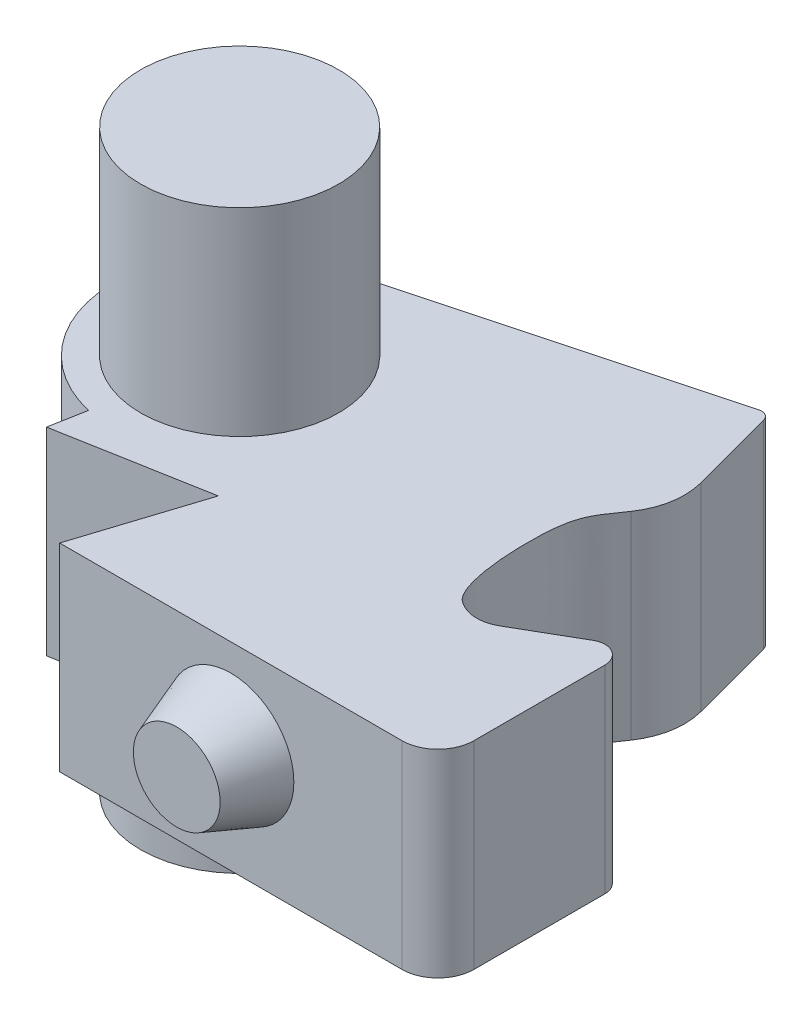
ISO-10303-21;
HEADER;
FILE_DESCRIPTION(('STEP AP214'),'2;1');
FILE_NAME('part.step','',(''),(''),'','','');
FILE_SCHEMA(('AUTOMOTIVE_DESIGN { 1 0 10303 214 1 1 1 1 }'));
ENDSEC;
DATA;
#1=APPLICATION_CONTEXT('core data for automotive mechanical design processes');
#2=APPLICATION_PROTOCOL_DEFINITION('international standard','automotive_design',2000,#1);
#3=PRODUCT_CONTEXT('',#1,'mechanical');
#4=PRODUCT('Part','Part','',(#3));
#5=PRODUCT_RELATED_PRODUCT_CATEGORY('part','',(#4));
#6=PRODUCT_DEFINITION_FORMATION('','',#4);
#7=PRODUCT_DEFINITION_CONTEXT('part definition',#1,'design');
#8=PRODUCT_DEFINITION('design','',#6,#7);
#9=PRODUCT_DEFINITION_SHAPE('','',#8);
#10=(LENGTH_UNIT() NAMED_UNIT(*) SI_UNIT(.MILLI.,.METRE.));
#11=(NAMED_UNIT(*) PLANE_ANGLE_UNIT() SI_UNIT($,.RADIAN.));
#12=(NAMED_UNIT(*) SI_UNIT($,.STERADIAN.) SOLID_ANGLE_UNIT());
#13=UNCERTAINTY_MEASURE_WITH_UNIT(LENGTH_MEASURE(1.E-05),#10,'distance_accuracy_value','');
#14=(GEOMETRIC_REPRESENTATION_CONTEXT(3) GLOBAL_UNCERTAINTY_ASSIGNED_CONTEXT((#13)) GLOBAL_UNIT_ASSIGNED_CONTEXT((#10,
#11,#12)) REPRESENTATION_CONTEXT('',''));
#15=CARTESIAN_POINT('',(0.,0.,0.));
#16=DIRECTION('',(0.,0.,1.));
#17=DIRECTION('',(1.,0.,0.));
#18=AXIS2_PLACEMENT_3D('',#15,#16,#17);
#19=CARTESIAN_POINT('',(3.01010442416642,2.2,-1.12998792942315));
#20=DIRECTION('',(0.,-1.,0.));
#21=DIRECTION('',(0.,0.,-1.));
#22=AXIS2_PLACEMENT_3D('',#19,#20,#21);
#23=CYLINDRICAL_SURFACE('',#22,0.8);
#24=CARTESIAN_POINT('',(3.01010442416642,0.,-1.12998792942315));
#25=DIRECTION('',(0.,1.,0.));
#26=DIRECTION('',(0.,0.,1.));
#27=AXIS2_PLACEMENT_3D('',#24,#25,#26);
#28=CIRCLE('',#27,0.8);
#29=CARTESIAN_POINT('',(3.78284508519767,0.,-1.33704316550517));
#30=VERTEX_POINT('',#29);
#31=CARTESIAN_POINT('',(3.66810176337064,0.,-0.674971993877858));
#32=VERTEX_POINT('',#31);
#33=EDGE_CURVE('E231',#30,#32,#28,.F.);
#34=ORIENTED_EDGE('',*,*,#33,.F.);
#35=DIRECTION('',(0.,-1.,0.));
#36=VECTOR('',#35,1.);
#37=CARTESIAN_POINT('',(3.78284508519767,2.2,-1.33704316550517));
#38=LINE('',#37,#36);
#39=CARTESIAN_POINT('',(3.78284508519767,2.2,-1.33704316550517));
#40=VERTEX_POINT('',#39);
#41=EDGE_CURVE('E295',#40,#30,#38,.T.);
#42=ORIENTED_EDGE('',*,*,#41,.F.);
#43=CARTESIAN_POINT('',(3.01010442416642,2.2,-1.12998792942315));
#44=DIRECTION('',(0.,1.,0.));
#45=DIRECTION('',(0.,0.,1.));
#46=AXIS2_PLACEMENT_3D('',#43,#44,#45);
#47=CIRCLE('',#46,0.8);
#48=CARTESIAN_POINT('',(3.66810176337064,2.2,-0.674971993877858));
#49=VERTEX_POINT('',#48);
#50=EDGE_CURVE('E375',#40,#49,#47,.F.);
#51=ORIENTED_EDGE('',*,*,#50,.T.);
#52=DIRECTION('',(0.,-1.,0.));
#53=VECTOR('',#52,1.);
#54=CARTESIAN_POINT('',(3.66810176337064,2.2,-0.674971993877858));
#55=LINE('',#54,#53);
#56=EDGE_CURVE('E163',#49,#32,#55,.T.);
#57=ORIENTED_EDGE('',*,*,#56,.T.);
#58=EDGE_LOOP('',(#34,#42,#51,#57));
#59=FACE_BOUND('',#58,.T.);
#60=ADVANCED_FACE('F88',(#59),#23,.T.);
#61=CARTESIAN_POINT('',(3.86370330515627,2.2,-1.0352761804101));
#62=DIRECTION('',(0.965925826289067,0.,-0.258819045102525));
#63=DIRECTION('',(-0.258819045102525,0.,-0.965925826289067));
#64=AXIS2_PLACEMENT_3D('',#61,#62,#63);
#65=PLANE('',#64);
#66=DIRECTION('',(0.258819045102525,0.,0.965925826289067));
#67=VECTOR('',#66,1.);
#68=CARTESIAN_POINT('',(3.86370330515627,0.,-1.0352761804101));
#69=LINE('',#68,#67);
#70=CARTESIAN_POINT('',(3.52723854652299,0.,-2.29097975458589));
#71=VERTEX_POINT('',#70);
#72=EDGE_CURVE('E238',#71,#30,#69,.T.);
#73=ORIENTED_EDGE('',*,*,#72,.F.);
#74=DIRECTION('',(0.,-1.,0.));
#75=VECTOR('',#74,1.);
#76=CARTESIAN_POINT('',(3.52723854652299,2.2,-2.29097975458589));
#77=LINE('',#76,#75);
#78=CARTESIAN_POINT('',(3.52723854652299,2.2,-2.29097975458589));
#79=VERTEX_POINT('',#78);
#80=EDGE_CURVE('E293',#79,#71,#77,.T.);
#81=ORIENTED_EDGE('',*,*,#80,.F.);
#82=DIRECTION('',(0.258819045102525,0.,0.965925826289067));
#83=VECTOR('',#82,1.);
#84=CARTESIAN_POINT('',(3.86370330515627,2.2,-1.0352761804101));
#85=LINE('',#84,#83);
#86=EDGE_CURVE('E378',#79,#40,#85,.T.);
#87=ORIENTED_EDGE('',*,*,#86,.T.);
#88=ORIENTED_EDGE('',*,*,#41,.T.);
#89=EDGE_LOOP('',(#73,#81,#87,#88));
#90=FACE_BOUND('',#89,.T.);
#91=ADVANCED_FACE('F317',(#90),#65,.T.);
#92=CARTESIAN_POINT('',(3.43064596389408,2.2,-2.26509785007563));
#93=DIRECTION('',(0.,-1.,0.));
#94=DIRECTION('',(0.,0.,-1.));
#95=AXIS2_PLACEMENT_3D('',#92,#93,#94);
#96=CYLINDRICAL_SURFACE('',#95,0.1);
#97=CARTESIAN_POINT('',(3.43064596389408,0.,-2.26509785007563));
#98=DIRECTION('',(0.,1.,0.));
#99=DIRECTION('',(0.,0.,1.));
#100=AXIS2_PLACEMENT_3D('',#97,#98,#99);
#101=CIRCLE('',#100,0.1);
#102=CARTESIAN_POINT('',(3.40476405938383,0.,-2.36169043270454));
#103=VERTEX_POINT('',#102);
#104=EDGE_CURVE('E241',#103,#71,#101,.F.);
#105=ORIENTED_EDGE('',*,*,#104,.F.);
#106=DIRECTION('',(0.,-1.,0.));
#107=VECTOR('',#106,1.);
#108=CARTESIAN_POINT('',(3.40476405938383,2.2,-2.36169043270454));
#109=LINE('',#108,#107);
#110=CARTESIAN_POINT('',(3.40476405938383,2.2,-2.36169043270454));
#111=VERTEX_POINT('',#110);
#112=EDGE_CURVE('E291',#111,#103,#109,.T.);
#113=ORIENTED_EDGE('',*,*,#112,.F.);
#114=CARTESIAN_POINT('',(3.43064596389408,2.2,-2.26509785007563));
#115=DIRECTION('',(0.,1.,0.));
#116=DIRECTION('',(0.,0.,1.));
#117=AXIS2_PLACEMENT_3D('',#114,#115,#116);
#118=CIRCLE('',#117,0.1);
#119=EDGE_CURVE('E380',#111,#79,#118,.F.);
#120=ORIENTED_EDGE('',*,*,#119,.T.);
#121=ORIENTED_EDGE('',*,*,#80,.T.);
#122=EDGE_LOOP('',(#105,#113,#120,#121));
#123=FACE_BOUND('',#122,.T.);
#124=ADVANCED_FACE('F322',(#123),#96,.T.);
#125=CARTESIAN_POINT('',(-0.362346663143535,2.2,-1.35229615680469));
#126=DIRECTION('',(-0.258819045102525,0.,-0.965925826289067));
#127=DIRECTION('',(-0.965925826289067,0.,0.258819045102525));
#128=AXIS2_PLACEMENT_3D('',#125,#126,#127);
#129=PLANE('',#128);
#130=DIRECTION('',(0.965925826289067,0.,-0.258819045102525));
#131=VECTOR('',#130,1.);
#132=CARTESIAN_POINT('',(-0.362346663143535,0.,-1.35229615680469));
#133=LINE('',#132,#131);
#134=CARTESIAN_POINT('',(-0.362346663143535,0.,-1.35229615680469));
#135=VERTEX_POINT('',#134);
#136=EDGE_CURVE('E244',#135,#103,#133,.T.);
#137=ORIENTED_EDGE('',*,*,#136,.F.);
#138=DIRECTION('',(0.,-1.,0.));
#139=VECTOR('',#138,1.);
#140=CARTESIAN_POINT('',(-0.362346663143535,2.2,-1.35229615680469));
#141=LINE('',#140,#139);
#142=CARTESIAN_POINT('',(-0.362346663143535,2.2,-1.35229615680469));
#143=VERTEX_POINT('',#142);
#144=EDGE_CURVE('E289',#143,#135,#141,.T.);
#145=ORIENTED_EDGE('',*,*,#144,.F.);
#146=DIRECTION('',(0.965925826289067,0.,-0.258819045102525));
#147=VECTOR('',#146,1.);
#148=CARTESIAN_POINT('',(-0.362346663143535,2.2,-1.35229615680469));
#149=LINE('',#148,#147);
#150=EDGE_CURVE('E389',#143,#111,#149,.T.);
#151=ORIENTED_EDGE('',*,*,#150,.T.);
#152=ORIENTED_EDGE('',*,*,#112,.T.);
#153=EDGE_LOOP('',(#137,#145,#151,#152));
#154=FACE_BOUND('',#153,.T.);
#155=ADVANCED_FACE('F329',(#154),#129,.T.);
#156=CARTESIAN_POINT('',(0.,2.2,0.));
#157=DIRECTION('',(0.,-1.,0.));
#158=DIRECTION('',(0.,0.,-1.));
#159=AXIS2_PLACEMENT_3D('',#156,#157,#158);
#160=CYLINDRICAL_SURFACE('',#159,1.4);
#161=CARTESIAN_POINT('',(0.,0.,0.));
#162=DIRECTION('',(0.,1.,0.));
#163=DIRECTION('',(0.,0.,1.));
#164=AXIS2_PLACEMENT_3D('',#161,#162,#163);
#165=CIRCLE('',#164,1.4);
#166=CARTESIAN_POINT('',(-0.313114699278254,0.,1.36453625275985));
#167=VERTEX_POINT('',#166);
#168=EDGE_CURVE('E247',#135,#167,#165,.T.);
#169=ORIENTED_EDGE('',*,*,#168,.T.);
#170=DIRECTION('',(0.,-1.,0.));
#171=VECTOR('',#170,1.);
#172=CARTESIAN_POINT('',(-0.313114699278254,2.2,1.36453625275985));
#173=LINE('',#172,#171);
#174=CARTESIAN_POINT('',(-0.313114699278254,2.2,1.36453625275985));
#175=VERTEX_POINT('',#174);
#176=EDGE_CURVE('E287',#175,#167,#173,.T.);
#177=ORIENTED_EDGE('',*,*,#176,.F.);
#178=CARTESIAN_POINT('',(0.,2.2,0.));
#179=DIRECTION('',(0.,1.,0.));
#180=DIRECTION('',(0.,0.,1.));
#181=AXIS2_PLACEMENT_3D('',#178,#179,#180);
#182=CIRCLE('',#181,1.4);
#183=EDGE_CURVE('E392',#143,#175,#182,.T.);
#184=ORIENTED_EDGE('',*,*,#183,.F.);
#185=ORIENTED_EDGE('',*,*,#144,.T.);
#186=EDGE_LOOP('',(#169,#177,#184,#185));
#187=FACE_BOUND('',#186,.T.);
#188=ADVANCED_FACE('F333',(#187),#160,.T.);
#189=CARTESIAN_POINT('',(-0.06002161020739,2.2,-0.0110433844233855));
#190=DIRECTION('',(-0.983491783248269,0.,-0.180952790205457));
#191=DIRECTION('',(-0.180952790205457,0.,0.983491783248269));
#192=AXIS2_PLACEMENT_3D('',#189,#190,#191);
#193=PLANE('',#192);
#194=DIRECTION('',(0.180952790205457,0.,-0.983491783248269));
#195=VECTOR('',#194,1.);
#196=CARTESIAN_POINT('',(-0.06002161020739,0.,-0.0110433844233855));
#197=LINE('',#196,#195);
#198=CARTESIAN_POINT('',(-0.385495815360437,0.,1.75793296605916));
#199=VERTEX_POINT('',#198);
#200=EDGE_CURVE('E250',#199,#167,#197,.T.);
#201=ORIENTED_EDGE('',*,*,#200,.F.);
#202=DIRECTION('',(0.,-1.,0.));
#203=VECTOR('',#202,1.);
#204=CARTESIAN_POINT('',(-0.385495815360437,2.2,1.75793296605916));
#205=LINE('',#204,#203);
#206=CARTESIAN_POINT('',(-0.385495815360437,2.2,1.75793296605916));
#207=VERTEX_POINT('',#206);
#208=EDGE_CURVE('E285',#207,#199,#205,.T.);
#209=ORIENTED_EDGE('',*,*,#208,.F.);
#210=DIRECTION('',(0.180952790205457,0.,-0.983491783248269));
#211=VECTOR('',#210,1.);
#212=CARTESIAN_POINT('',(-0.06002161020739,2.2,-0.0110433844233855));
#213=LINE('',#212,#211);
#214=EDGE_CURVE('E394',#207,#175,#213,.T.);
#215=ORIENTED_EDGE('',*,*,#214,.T.);
#216=ORIENTED_EDGE('',*,*,#176,.T.);
#217=EDGE_LOOP('',(#201,#209,#215,#216));
#218=FACE_BOUND('',#217,.T.);
#219=ADVANCED_FACE('F337',(#218),#193,.T.);
#220=CARTESIAN_POINT('',(0.294621627806033,2.2,1.63540866197282));
#221=DIRECTION('',(-0.177297594343693,0.,-0.984157285722124));
#222=DIRECTION('',(-0.984157285722124,0.,0.177297594343693));
#223=AXIS2_PLACEMENT_3D('',#220,#221,#222);
#224=PLANE('',#223);
#225=DIRECTION('',(0.984157285722124,0.,-0.177297594343693));
#226=VECTOR('',#225,1.);
#227=CARTESIAN_POINT('',(0.294621627806033,0.,1.63540866197282));
#228=LINE('',#227,#226);
#229=CARTESIAN_POINT('',(1.22959577517569,0.,1.46697149292768));
#230=VERTEX_POINT('',#229);
#231=EDGE_CURVE('E253',#199,#230,#228,.T.);
#232=ORIENTED_EDGE('',*,*,#231,.T.);
#233=DIRECTION('',(0.,-1.,0.));
#234=VECTOR('',#233,1.);
#235=CARTESIAN_POINT('',(1.22959577517569,2.2,1.46697149292768));
#236=LINE('',#235,#234);
#237=CARTESIAN_POINT('',(1.22959577517569,2.2,1.46697149292768));
#238=VERTEX_POINT('',#237);
#239=EDGE_CURVE('E283',#238,#230,#236,.T.);
#240=ORIENTED_EDGE('',*,*,#239,.F.);
#241=DIRECTION('',(0.984157285722124,0.,-0.177297594343693));
#242=VECTOR('',#241,1.);
#243=CARTESIAN_POINT('',(0.294621627806033,2.2,1.63540866197282));
#244=LINE('',#243,#242);
#245=EDGE_CURVE('E397',#207,#238,#244,.T.);
#246=ORIENTED_EDGE('',*,*,#245,.F.);
#247=ORIENTED_EDGE('',*,*,#208,.T.);
#248=EDGE_LOOP('',(#232,#240,#246,#247));
#249=FACE_BOUND('',#248,.T.);
#250=ADVANCED_FACE('F341',(#249),#224,.F.);
#251=CARTESIAN_POINT('',(1.54161660294166,2.2,0.494770745431223));
#252=DIRECTION('',(-0.952163219337372,0.,-0.305589927420867));
#253=DIRECTION('',(-0.305589927420867,0.,0.952163219337372));
#254=AXIS2_PLACEMENT_3D('',#251,#252,#253);
#255=PLANE('',#254);
#256=DIRECTION('',(0.305589927420867,0.,-0.952163219337372));
#257=VECTOR('',#256,1.);
#258=CARTESIAN_POINT('',(1.54161660294166,0.,0.494770745431223));
#259=LINE('',#258,#257);
#260=CARTESIAN_POINT('',(0.801769876786476,0.,2.8));
#261=VERTEX_POINT('',#260);
#262=EDGE_CURVE('E256',#261,#230,#259,.T.);
#263=ORIENTED_EDGE('',*,*,#262,.F.);
#264=DIRECTION('',(0.,-1.,0.));
#265=VECTOR('',#264,1.);
#266=CARTESIAN_POINT('',(0.801769876786476,2.2,2.8));
#267=LINE('',#266,#265);
#268=CARTESIAN_POINT('',(0.801769876786476,2.2,2.8));
#269=VERTEX_POINT('',#268);
#270=EDGE_CURVE('E281',#269,#261,#267,.T.);
#271=ORIENTED_EDGE('',*,*,#270,.F.);
#272=DIRECTION('',(0.305589927420867,0.,-0.952163219337372));
#273=VECTOR('',#272,1.);
#274=CARTESIAN_POINT('',(1.54161660294166,2.2,0.494770745431223));
#275=LINE('',#274,#273);
#276=EDGE_CURVE('E399',#269,#238,#275,.T.);
#277=ORIENTED_EDGE('',*,*,#276,.T.);
#278=ORIENTED_EDGE('',*,*,#239,.T.);
#279=EDGE_LOOP('',(#263,#271,#277,#278));
#280=FACE_BOUND('',#279,.T.);
#281=ADVANCED_FACE('F345',(#280),#255,.T.);
#282=CARTESIAN_POINT('',(0.,2.2,2.8));
#283=DIRECTION('',(0.,0.,-1.));
#284=DIRECTION('',(-1.,0.,0.));
#285=AXIS2_PLACEMENT_3D('',#282,#283,#284);
#286=PLANE('',#285);
#287=CARTESIAN_POINT('',(2.70176987678648,1.2,2.8));
#288=DIRECTION('',(0.,0.,-1.));
#289=DIRECTION('',(-1.,0.,0.));
#290=AXIS2_PLACEMENT_3D('',#287,#288,#289);
#291=CIRCLE('',#290,0.7);
#292=CARTESIAN_POINT('',(2.00176987678648,1.2,2.8));
#293=VERTEX_POINT('',#292);
#294=EDGE_CURVE('E12',#293,#293,#291,.F.);
#295=ORIENTED_EDGE('',*,*,#294,.F.);
#296=EDGE_LOOP('',(#295));
#297=FACE_BOUND('',#296,.T.);
#298=DIRECTION('',(1.,0.,0.));
#299=VECTOR('',#298,1.);
#300=CARTESIAN_POINT('',(0.,0.,2.8));
#301=LINE('',#300,#299);
#302=CARTESIAN_POINT('',(4.60176987678648,0.,2.8));
#303=VERTEX_POINT('',#302);
#304=EDGE_CURVE('E259',#261,#303,#301,.T.);
#305=ORIENTED_EDGE('',*,*,#304,.T.);
#306=DIRECTION('',(0.,-1.,0.));
#307=VECTOR('',#306,1.);
#308=CARTESIAN_POINT('',(4.60176987678648,2.2,2.8));
#309=LINE('',#308,#307);
#310=CARTESIAN_POINT('',(4.60176987678648,2.2,2.8));
#311=VERTEX_POINT('',#310);
#312=EDGE_CURVE('E278',#311,#303,#309,.T.);
#313=ORIENTED_EDGE('',*,*,#312,.F.);
#314=DIRECTION('',(1.,0.,0.));
#315=VECTOR('',#314,1.);
#316=CARTESIAN_POINT('',(0.,2.2,2.8));
#317=LINE('',#316,#315);
#318=EDGE_CURVE('E402',#269,#311,#317,.T.);
#319=ORIENTED_EDGE('',*,*,#318,.F.);
#320=ORIENTED_EDGE('',*,*,#270,.T.);
#321=EDGE_LOOP('',(#305,#313,#319,#320));
#322=FACE_BOUND('',#321,.T.);
#323=ADVANCED_FACE('F349',(#297,#322),#286,.F.);
#324=CARTESIAN_POINT('',(4.60176987678648,2.2,2.4));
#325=DIRECTION('',(0.,-1.,0.));
#326=DIRECTION('',(0.,0.,-1.));
#327=AXIS2_PLACEMENT_3D('',#324,#325,#326);
#328=CYLINDRICAL_SURFACE('',#327,0.400000000000001);
#329=CARTESIAN_POINT('',(4.60176987678648,0.,2.4));
#330=DIRECTION('',(0.,1.,0.));
#331=DIRECTION('',(0.,0.,1.));
#332=AXIS2_PLACEMENT_3D('',#329,#330,#331);
#333=CIRCLE('',#332,0.400000000000001);
#334=CARTESIAN_POINT('',(5.00176987678648,0.,2.4));
#335=VERTEX_POINT('',#334);
#336=EDGE_CURVE('E261',#303,#335,#333,.T.);
#337=ORIENTED_EDGE('',*,*,#336,.T.);
#338=DIRECTION('',(0.,-1.,0.));
#339=VECTOR('',#338,1.);
#340=CARTESIAN_POINT('',(5.00176987678648,2.2,2.4));
#341=LINE('',#340,#339);
#342=CARTESIAN_POINT('',(5.00176987678648,2.2,2.4));
#343=VERTEX_POINT('',#342);
#344=EDGE_CURVE('E275',#343,#335,#341,.T.);
#345=ORIENTED_EDGE('',*,*,#344,.F.);
#346=CARTESIAN_POINT('',(4.60176987678648,2.2,2.4));
#347=DIRECTION('',(0.,1.,0.));
#348=DIRECTION('',(0.,0.,1.));
#349=AXIS2_PLACEMENT_3D('',#346,#347,#348);
#350=CIRCLE('',#349,0.400000000000001);
#351=EDGE_CURVE('E404',#311,#343,#350,.T.);
#352=ORIENTED_EDGE('',*,*,#351,.F.);
#353=ORIENTED_EDGE('',*,*,#312,.T.);
#354=EDGE_LOOP('',(#337,#345,#352,#353));
#355=FACE_BOUND('',#354,.T.);
#356=ADVANCED_FACE('F353',(#355),#328,.T.);
#357=CARTESIAN_POINT('',(5.00176987678648,2.2,0.));
#358=DIRECTION('',(-1.,0.,0.));
#359=DIRECTION('',(0.,0.,1.));
#360=AXIS2_PLACEMENT_3D('',#357,#358,#359);
#361=PLANE('',#360);
#362=DIRECTION('',(0.,0.,-1.));
#363=VECTOR('',#362,1.);
#364=CARTESIAN_POINT('',(5.00176987678648,0.,0.));
#365=LINE('',#364,#363);
#366=CARTESIAN_POINT('',(5.00176987678648,0.,0.946410161513778));
#367=VERTEX_POINT('',#366);
#368=EDGE_CURVE('E263',#335,#367,#365,.T.);
#369=ORIENTED_EDGE('',*,*,#368,.T.);
#370=DIRECTION('',(0.,-1.,0.));
#371=VECTOR('',#370,1.);
#372=CARTESIAN_POINT('',(5.00176987678648,2.2,0.946410161513778));
#373=LINE('',#372,#371);
#374=CARTESIAN_POINT('',(5.00176987678648,2.2,0.946410161513778));
#375=VERTEX_POINT('',#374);
#376=EDGE_CURVE('E219',#375,#367,#373,.T.);
#377=ORIENTED_EDGE('',*,*,#376,.F.);
#378=DIRECTION('',(0.,0.,-1.));
#379=VECTOR('',#378,1.);
#380=CARTESIAN_POINT('',(5.00176987678648,2.2,0.));
#381=LINE('',#380,#379);
#382=EDGE_CURVE('E207',#343,#375,#381,.T.);
#383=ORIENTED_EDGE('',*,*,#382,.F.);
#384=ORIENTED_EDGE('',*,*,#344,.T.);
#385=EDGE_LOOP('',(#369,#377,#383,#384));
#386=FACE_BOUND('',#385,.T.);
#387=ADVANCED_FACE('F357',(#386),#361,.F.);
#388=CARTESIAN_POINT('',(4.80176987678648,2.2,0.946410161513778));
#389=DIRECTION('',(0.,-1.,0.));
#390=DIRECTION('',(0.,0.,-1.));
#391=AXIS2_PLACEMENT_3D('',#388,#389,#390);
#392=CYLINDRICAL_SURFACE('',#391,0.2);
#393=CARTESIAN_POINT('',(4.80176987678648,0.,0.946410161513778));
#394=DIRECTION('',(0.,1.,0.));
#395=DIRECTION('',(0.,0.,1.));
#396=AXIS2_PLACEMENT_3D('',#393,#394,#395);
#397=CIRCLE('',#396,0.2);
#398=CARTESIAN_POINT('',(4.70176987678648,0.,0.77320508075689));
#399=VERTEX_POINT('',#398);
#400=EDGE_CURVE('E216',#367,#399,#397,.T.);
#401=ORIENTED_EDGE('',*,*,#400,.T.);
#402=DIRECTION('',(0.,-1.,0.));
#403=VECTOR('',#402,1.);
#404=CARTESIAN_POINT('',(4.70176987678648,2.2,0.77320508075689));
#405=LINE('',#404,#403);
#406=CARTESIAN_POINT('',(4.70176987678648,2.2,0.77320508075689));
#407=VERTEX_POINT('',#406);
#408=EDGE_CURVE('E213',#407,#399,#405,.T.);
#409=ORIENTED_EDGE('',*,*,#408,.F.);
#410=CARTESIAN_POINT('',(4.80176987678648,2.2,0.946410161513778));
#411=DIRECTION('',(0.,1.,0.));
#412=DIRECTION('',(0.,0.,1.));
#413=AXIS2_PLACEMENT_3D('',#410,#411,#412);
#414=CIRCLE('',#413,0.2);
#415=EDGE_CURVE('E200',#375,#407,#414,.T.);
#416=ORIENTED_EDGE('',*,*,#415,.F.);
#417=ORIENTED_EDGE('',*,*,#376,.T.);
#418=EDGE_LOOP('',(#401,#409,#416,#417));
#419=FACE_BOUND('',#418,.T.);
#420=ADVANCED_FACE('F214',(#419),#392,.T.);
#421=CARTESIAN_POINT('',(1.51025009033198,2.2,2.61582988859044));
#422=DIRECTION('',(0.500000000000005,0.,0.866025403784436));
#423=DIRECTION('',(0.866025403784436,0.,-0.500000000000005));
#424=AXIS2_PLACEMENT_3D('',#421,#422,#423);
#425=PLANE('',#424);
#426=DIRECTION('',(-0.866025403784436,0.,0.500000000000005));
#427=VECTOR('',#426,1.);
#428=CARTESIAN_POINT('',(1.51025009033198,0.,2.61582988859044));
#429=LINE('',#428,#427);
#430=CARTESIAN_POINT('',(4.04162576229147,0.,1.15433946296453));
#431=VERTEX_POINT('',#430);
#432=EDGE_CURVE('E266',#399,#431,#429,.T.);
#433=ORIENTED_EDGE('',*,*,#432,.T.);
#434=DIRECTION('',(0.,-1.,0.));
#435=VECTOR('',#434,1.);
#436=CARTESIAN_POINT('',(4.04162576229147,2.2,1.15433946296453));
#437=LINE('',#436,#435);
#438=CARTESIAN_POINT('',(4.04162576229147,2.2,1.15433946296453));
#439=VERTEX_POINT('',#438);
#440=EDGE_CURVE('E154',#439,#431,#437,.T.);
#441=ORIENTED_EDGE('',*,*,#440,.F.);
#442=DIRECTION('',(-0.866025403784436,0.,0.500000000000005));
#443=VECTOR('',#442,1.);
#444=CARTESIAN_POINT('',(1.51025009033198,2.2,2.61582988859044));
#445=LINE('',#444,#443);
#446=EDGE_CURVE('E205',#407,#439,#445,.T.);
#447=ORIENTED_EDGE('',*,*,#446,.F.);
#448=ORIENTED_EDGE('',*,*,#408,.T.);
#449=EDGE_LOOP('',(#433,#441,#447,#448));
#450=FACE_BOUND('',#449,.T.);
#451=ADVANCED_FACE('F221',(#450),#425,.F.);
#452=CARTESIAN_POINT('',(3.84162576229147,2.2,0.807929301450761));
#453=DIRECTION('',(0.,-1.,0.));
#454=DIRECTION('',(0.,0.,-1.));
#455=AXIS2_PLACEMENT_3D('',#452,#453,#454);
#456=CYLINDRICAL_SURFACE('',#455,0.4);
#457=CARTESIAN_POINT('',(3.84162576229147,0.,0.807929301450761));
#458=DIRECTION('',(0.,1.,0.));
#459=DIRECTION('',(0.,0.,1.));
#460=AXIS2_PLACEMENT_3D('',#457,#458,#459);
#461=CIRCLE('',#460,0.4);
#462=CARTESIAN_POINT('',(3.59870574426679,0.,1.12571832713115));
#463=VERTEX_POINT('',#462);
#464=EDGE_CURVE('E268',#463,#431,#461,.T.);
#465=ORIENTED_EDGE('',*,*,#464,.F.);
#466=DIRECTION('',(0.,-1.,0.));
#467=VECTOR('',#466,1.);
#468=CARTESIAN_POINT('',(3.59870574426679,2.2,1.12571832713115));
#469=LINE('',#468,#467);
#470=CARTESIAN_POINT('',(3.59870574426679,2.2,1.12571832713115));
#471=VERTEX_POINT('',#470);
#472=EDGE_CURVE('E106',#471,#463,#469,.T.);
#473=ORIENTED_EDGE('',*,*,#472,.F.);
#474=CARTESIAN_POINT('',(3.84162576229147,2.2,0.807929301450761));
#475=DIRECTION('',(0.,1.,0.));
#476=DIRECTION('',(0.,0.,1.));
#477=AXIS2_PLACEMENT_3D('',#474,#475,#476);
#478=CIRCLE('',#477,0.4);
#479=EDGE_CURVE('E222',#471,#439,#478,.T.);
#480=ORIENTED_EDGE('',*,*,#479,.T.);
#481=ORIENTED_EDGE('',*,*,#440,.T.);
#482=EDGE_LOOP('',(#465,#473,#480,#481));
#483=FACE_BOUND('',#482,.T.);
#484=ADVANCED_FACE('F366',(#483),#456,.F.);
#485=CARTESIAN_POINT('',(3.66810176337064,2.2,-0.674971993877858));
#486=CARTESIAN_POINT('',(3.50781117142684,2.2,-0.443176193425082));
#487=CARTESIAN_POINT('',(3.33791958259418,2.2,-0.271573974009884));
#488=CARTESIAN_POINT('',(3.4163496633848,2.2,0.98632414144485));
#489=CARTESIAN_POINT('',(3.59870574426679,2.2,1.12571832713115));
#490=B_SPLINE_CURVE_WITH_KNOTS('',3,(#485,#486,#487,#488,#489),.UNSPECIFIED.,.F.,.F.,(4,1,4),
(0.0762238878281252,0.275181008384904,0.474138128941683),.UNSPECIFIED.);
#491=DIRECTION('',(0.,-1.,0.));
#492=VECTOR('',#491,1.);
#493=SURFACE_OF_LINEAR_EXTRUSION('',#490,#492);
#494=CARTESIAN_POINT('',(3.66810176337064,0.,-0.674971993877858));
#495=CARTESIAN_POINT('',(3.50781117142684,0.,-0.443176193425082));
#496=CARTESIAN_POINT('',(3.33791958259418,0.,-0.271573974009884));
#497=CARTESIAN_POINT('',(3.4163496633848,0.,0.98632414144485));
#498=CARTESIAN_POINT('',(3.59870574426679,0.,1.12571832713115));
#499=B_SPLINE_CURVE_WITH_KNOTS('',3,(#494,#495,#496,#497,#498),.UNSPECIFIED.,.F.,.F.,(4,1,4),
(0.0762238878281252,0.275181008384904,0.474138128941683),.UNSPECIFIED.);
#500=EDGE_CURVE('E227',#32,#463,#499,.T.);
#501=ORIENTED_EDGE('',*,*,#500,.F.);
#502=ORIENTED_EDGE('',*,*,#56,.F.);
#503=EDGE_CURVE('E271',#49,#471,#490,.T.);
#504=ORIENTED_EDGE('',*,*,#503,.T.);
#505=ORIENTED_EDGE('',*,*,#472,.T.);
#506=EDGE_LOOP('',(#501,#502,#504,#505));
#507=FACE_BOUND('',#506,.T.);
#508=ADVANCED_FACE('F90',(#507),#493,.T.);
#509=CARTESIAN_POINT('',(0.,0.,0.));
#510=DIRECTION('',(0.,1.,0.));
#511=DIRECTION('',(0.,0.,1.));
#512=AXIS2_PLACEMENT_3D('',#509,#510,#511);
#513=PLANE('',#512);
#514=CARTESIAN_POINT('',(0.,0.,0.));
#515=DIRECTION('',(0.,1.,0.));
#516=DIRECTION('',(0.,0.,1.));
#517=AXIS2_PLACEMENT_3D('',#514,#515,#516);
#518=CIRCLE('',#517,1.1);
#519=CARTESIAN_POINT('',(0.,0.,1.1));
#520=VERTEX_POINT('',#519);
#521=EDGE_CURVE('E232',#520,#520,#518,.T.);
#522=ORIENTED_EDGE('',*,*,#521,.T.);
#523=EDGE_LOOP('',(#522));
#524=FACE_BOUND('',#523,.T.);
#525=ORIENTED_EDGE('',*,*,#500,.T.);
#526=ORIENTED_EDGE('',*,*,#464,.T.);
#527=ORIENTED_EDGE('',*,*,#432,.F.);
#528=ORIENTED_EDGE('',*,*,#400,.F.);
#529=ORIENTED_EDGE('',*,*,#368,.F.);
#530=ORIENTED_EDGE('',*,*,#336,.F.);
#531=ORIENTED_EDGE('',*,*,#304,.F.);
#532=ORIENTED_EDGE('',*,*,#262,.T.);
#533=ORIENTED_EDGE('',*,*,#231,.F.);
#534=ORIENTED_EDGE('',*,*,#200,.T.);
#535=ORIENTED_EDGE('',*,*,#168,.F.);
#536=ORIENTED_EDGE('',*,*,#136,.T.);
#537=ORIENTED_EDGE('',*,*,#104,.T.);
#538=ORIENTED_EDGE('',*,*,#72,.T.);
#539=ORIENTED_EDGE('',*,*,#33,.T.);
#540=EDGE_LOOP('',(#525,#526,#527,#528,#529,#530,#531,#532,#533,#534,#535,#536,#537,#538,#539));
#541=FACE_BOUND('',#540,.T.);
#542=ADVANCED_FACE('F305',(#524,#541),#513,.F.);
#543=CARTESIAN_POINT('',(0.,2.2,0.));
#544=DIRECTION('',(0.,1.,0.));
#545=DIRECTION('',(0.,0.,1.));
#546=AXIS2_PLACEMENT_3D('',#543,#544,#545);
#547=PLANE('',#546);
#548=CARTESIAN_POINT('',(0.,2.2,0.));
#549=DIRECTION('',(0.,1.,0.));
#550=DIRECTION('',(0.,0.,1.));
#551=AXIS2_PLACEMENT_3D('',#548,#549,#550);
#552=CIRCLE('',#551,1.1);
#553=CARTESIAN_POINT('',(0.,2.2,1.1));
#554=VERTEX_POINT('',#553);
#555=EDGE_CURVE('E98',#554,#554,#552,.T.);
#556=ORIENTED_EDGE('',*,*,#555,.F.);
#557=EDGE_LOOP('',(#556));
#558=FACE_BOUND('',#557,.T.);
#559=ORIENTED_EDGE('',*,*,#503,.F.);
#560=ORIENTED_EDGE('',*,*,#50,.F.);
#561=ORIENTED_EDGE('',*,*,#86,.F.);
#562=ORIENTED_EDGE('',*,*,#119,.F.);
#563=ORIENTED_EDGE('',*,*,#150,.F.);
#564=ORIENTED_EDGE('',*,*,#183,.T.);
#565=ORIENTED_EDGE('',*,*,#214,.F.);
#566=ORIENTED_EDGE('',*,*,#245,.T.);
#567=ORIENTED_EDGE('',*,*,#276,.F.);
#568=ORIENTED_EDGE('',*,*,#318,.T.);
#569=ORIENTED_EDGE('',*,*,#351,.T.);
#570=ORIENTED_EDGE('',*,*,#382,.T.);
#571=ORIENTED_EDGE('',*,*,#415,.T.);
#572=ORIENTED_EDGE('',*,*,#446,.T.);
#573=ORIENTED_EDGE('',*,*,#479,.F.);
#574=EDGE_LOOP('',(#559,#560,#561,#562,#563,#564,#565,#566,#567,#568,#569,#570,#571,#572,#573));
#575=FACE_BOUND('',#574,.T.);
#576=ADVANCED_FACE('F202',(#558,#575),#547,.T.);
#577=CARTESIAN_POINT('',(0.,4.4,0.));
#578=DIRECTION('',(0.,1.,0.));
#579=DIRECTION('',(0.,0.,1.));
#580=AXIS2_PLACEMENT_3D('',#577,#578,#579);
#581=PLANE('',#580);
#582=CARTESIAN_POINT('',(0.,4.4,0.));
#583=DIRECTION('',(0.,1.,0.));
#584=DIRECTION('',(0.,0.,1.));
#585=AXIS2_PLACEMENT_3D('',#582,#583,#584);
#586=CIRCLE('',#585,1.1);
#587=CARTESIAN_POINT('',(0.,4.4,1.1));
#588=VERTEX_POINT('',#587);
#589=EDGE_CURVE('E435',#588,#588,#586,.T.);
#590=ORIENTED_EDGE('',*,*,#589,.T.);
#591=EDGE_LOOP('',(#590));
#592=FACE_BOUND('',#591,.T.);
#593=ADVANCED_FACE('F304',(#592),#581,.T.);
#594=CARTESIAN_POINT('',(0.,-2.,0.));
#595=DIRECTION('',(0.,1.,0.));
#596=DIRECTION('',(0.,0.,1.));
#597=AXIS2_PLACEMENT_3D('',#594,#595,#596);
#598=CYLINDRICAL_SURFACE('',#597,1.1);
#599=ORIENTED_EDGE('',*,*,#555,.T.);
#600=EDGE_LOOP('',(#599));
#601=FACE_BOUND('',#600,.T.);
#602=ORIENTED_EDGE('',*,*,#589,.F.);
#603=EDGE_LOOP('',(#602));
#604=FACE_BOUND('',#603,.T.);
#605=ADVANCED_FACE('F300',(#601,#604),#598,.T.);
#606=CARTESIAN_POINT('',(0.,-2.,0.));
#607=DIRECTION('',(0.,1.,0.));
#608=DIRECTION('',(0.,0.,1.));
#609=AXIS2_PLACEMENT_3D('',#606,#607,#608);
#610=CIRCLE('',#609,1.1);
#611=CARTESIAN_POINT('',(0.,-2.,1.1));
#612=VERTEX_POINT('',#611);
#613=EDGE_CURVE('E432',#612,#612,#610,.T.);
#614=ORIENTED_EDGE('',*,*,#613,.T.);
#615=EDGE_LOOP('',(#614));
#616=FACE_BOUND('',#615,.T.);
#617=ORIENTED_EDGE('',*,*,#521,.F.);
#618=EDGE_LOOP('',(#617));
#619=FACE_BOUND('',#618,.T.);
#620=ADVANCED_FACE('F455',(#616,#619),#598,.T.);
#621=CARTESIAN_POINT('',(0.,-2.,0.));
#622=DIRECTION('',(0.,1.,0.));
#623=DIRECTION('',(0.,0.,1.));
#624=AXIS2_PLACEMENT_3D('',#621,#622,#623);
#625=PLANE('',#624);
#626=ORIENTED_EDGE('',*,*,#613,.F.);
#627=EDGE_LOOP('',(#626));
#628=FACE_BOUND('',#627,.T.);
#629=ADVANCED_FACE('F447',(#628),#625,.F.);
#630=CARTESIAN_POINT('',(2.70176987678648,1.2,2.8));
#631=DIRECTION('',(0.,0.,-1.));
#632=DIRECTION('',(1.,0.,0.));
#633=AXIS2_PLACEMENT_3D('',#630,#631,#632);
#634=CONICAL_SURFACE('',#633,0.7,0.349065850398867);
#635=CARTESIAN_POINT('',(2.70176987678648,1.2,3.4));
#636=DIRECTION('',(0.,0.,1.));
#637=DIRECTION('',(1.,0.,0.));
#638=AXIS2_PLACEMENT_3D('',#635,#636,#637);
#639=CIRCLE('',#638,0.481617859440278);
#640=CARTESIAN_POINT('',(3.18338773622675,1.2,3.4));
#641=VERTEX_POINT('',#640);
#642=EDGE_CURVE('E438',#641,#641,#639,.T.);
#643=ORIENTED_EDGE('',*,*,#642,.F.);
#644=EDGE_LOOP('',(#643));
#645=FACE_BOUND('',#644,.T.);
#646=ORIENTED_EDGE('',*,*,#294,.T.);
#647=EDGE_LOOP('',(#646));
#648=FACE_BOUND('',#647,.T.);
#649=ADVANCED_FACE('F444',(#645,#648),#634,.T.);
#650=CARTESIAN_POINT('',(2.70176987678648,1.2,3.4));
#651=DIRECTION('',(0.,0.,1.));
#652=DIRECTION('',(1.,0.,0.));
#653=AXIS2_PLACEMENT_3D('',#650,#651,#652);
#654=PLANE('',#653);
#655=ORIENTED_EDGE('',*,*,#642,.T.);
#656=EDGE_LOOP('',(#655));
#657=FACE_BOUND('',#656,.T.);
#658=ADVANCED_FACE('F442',(#657),#654,.T.);
#659=CLOSED_SHELL('',(#60,#91,#124,#155,#188,#219,#250,#281,#323,#356,#387,#420,#451,#484,#508,
#542,#576,#593,#605,#620,#629,#649,#658));
#660=MANIFOLD_SOLID_BREP('B2',#659);
#661=ADVANCED_BREP_SHAPE_REPRESENTATION('',(#18,#660),#14);
#662=SHAPE_DEFINITION_REPRESENTATION(#9,#661);
ENDSEC;
END-ISO-10303-21;
